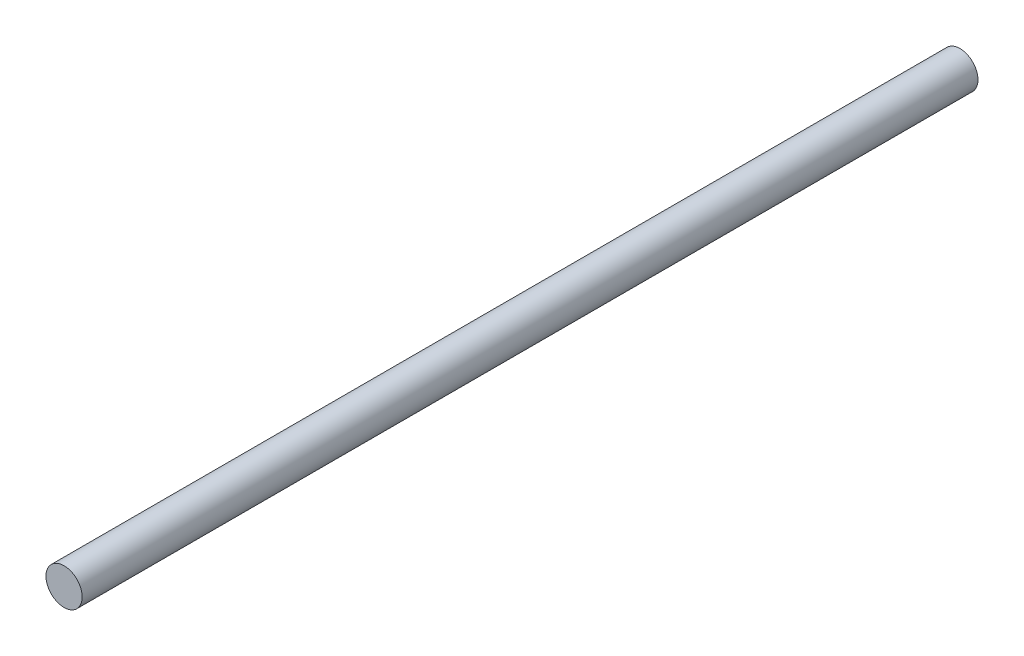
ISO-10303-21;
HEADER;
FILE_DESCRIPTION(('STEP AP214'),'2;1');
FILE_NAME('part.step','',(''),(''),'','','');
FILE_SCHEMA(('AUTOMOTIVE_DESIGN { 1 0 10303 214 1 1 1 1 }'));
ENDSEC;
DATA;
#1=APPLICATION_CONTEXT('core data for automotive mechanical design processes');
#2=APPLICATION_PROTOCOL_DEFINITION('international standard','automotive_design',2000,#1);
#3=PRODUCT_CONTEXT('',#1,'mechanical');
#4=PRODUCT('Part','Part','',(#3));
#5=PRODUCT_RELATED_PRODUCT_CATEGORY('part','',(#4));
#6=PRODUCT_DEFINITION_FORMATION('','',#4);
#7=PRODUCT_DEFINITION_CONTEXT('part definition',#1,'design');
#8=PRODUCT_DEFINITION('design','',#6,#7);
#9=PRODUCT_DEFINITION_SHAPE('','',#8);
#10=(LENGTH_UNIT() NAMED_UNIT(*) SI_UNIT(.MILLI.,.METRE.));
#11=(NAMED_UNIT(*) PLANE_ANGLE_UNIT() SI_UNIT($,.RADIAN.));
#12=(NAMED_UNIT(*) SI_UNIT($,.STERADIAN.) SOLID_ANGLE_UNIT());
#13=UNCERTAINTY_MEASURE_WITH_UNIT(LENGTH_MEASURE(1.E-05),#10,'distance_accuracy_value','');
#14=(GEOMETRIC_REPRESENTATION_CONTEXT(3) GLOBAL_UNCERTAINTY_ASSIGNED_CONTEXT((#13)) GLOBAL_UNIT_ASSIGNED_CONTEXT((#10,
#11,#12)) REPRESENTATION_CONTEXT('',''));
#15=CARTESIAN_POINT('',(0.,0.,0.));
#16=DIRECTION('',(0.,0.,1.));
#17=DIRECTION('',(1.,0.,0.));
#18=AXIS2_PLACEMENT_3D('',#15,#16,#17);
#19=CARTESIAN_POINT('',(0.,0.,495.));
#20=DIRECTION('',(0.,0.,-1.));
#21=DIRECTION('',(-1.,0.,0.));
#22=AXIS2_PLACEMENT_3D('',#19,#20,#21);
#23=CYLINDRICAL_SURFACE('',#22,10.);
#24=CARTESIAN_POINT('',(0.,0.,495.));
#25=DIRECTION('',(0.,0.,1.));
#26=DIRECTION('',(1.,0.,0.));
#27=AXIS2_PLACEMENT_3D('',#24,#25,#26);
#28=CIRCLE('',#27,10.);
#29=CARTESIAN_POINT('',(10.,0.,495.));
#30=VERTEX_POINT('',#29);
#31=EDGE_CURVE('E10',#30,#30,#28,.T.);
#32=ORIENTED_EDGE('',*,*,#31,.F.);
#33=EDGE_LOOP('',(#32));
#34=FACE_BOUND('',#33,.T.);
#35=CARTESIAN_POINT('',(0.,0.,0.));
#36=DIRECTION('',(0.,0.,1.));
#37=DIRECTION('',(1.,0.,0.));
#38=AXIS2_PLACEMENT_3D('',#35,#36,#37);
#39=CIRCLE('',#38,10.);
#40=CARTESIAN_POINT('',(10.,0.,0.));
#41=VERTEX_POINT('',#40);
#42=EDGE_CURVE('E35',#41,#41,#39,.T.);
#43=ORIENTED_EDGE('',*,*,#42,.T.);
#44=EDGE_LOOP('',(#43));
#45=FACE_BOUND('',#44,.T.);
#46=ADVANCED_FACE('F32',(#34,#45),#23,.T.);
#47=CARTESIAN_POINT('',(0.,0.,495.));
#48=DIRECTION('',(0.,0.,1.));
#49=DIRECTION('',(1.,0.,0.));
#50=AXIS2_PLACEMENT_3D('',#47,#48,#49);
#51=PLANE('',#50);
#52=ORIENTED_EDGE('',*,*,#31,.T.);
#53=EDGE_LOOP('',(#52));
#54=FACE_BOUND('',#53,.T.);
#55=ADVANCED_FACE('F47',(#54),#51,.T.);
#56=CARTESIAN_POINT('',(0.,0.,0.));
#57=DIRECTION('',(0.,0.,1.));
#58=DIRECTION('',(1.,0.,0.));
#59=AXIS2_PLACEMENT_3D('',#56,#57,#58);
#60=PLANE('',#59);
#61=ORIENTED_EDGE('',*,*,#42,.F.);
#62=EDGE_LOOP('',(#61));
#63=FACE_BOUND('',#62,.T.);
#64=ADVANCED_FACE('F45',(#63),#60,.F.);
#65=CLOSED_SHELL('',(#46,#55,#64));
#66=MANIFOLD_SOLID_BREP('B2',#65);
#67=ADVANCED_BREP_SHAPE_REPRESENTATION('',(#18,#66),#14);
#68=SHAPE_DEFINITION_REPRESENTATION(#9,#67);
ENDSEC;
END-ISO-10303-21;
